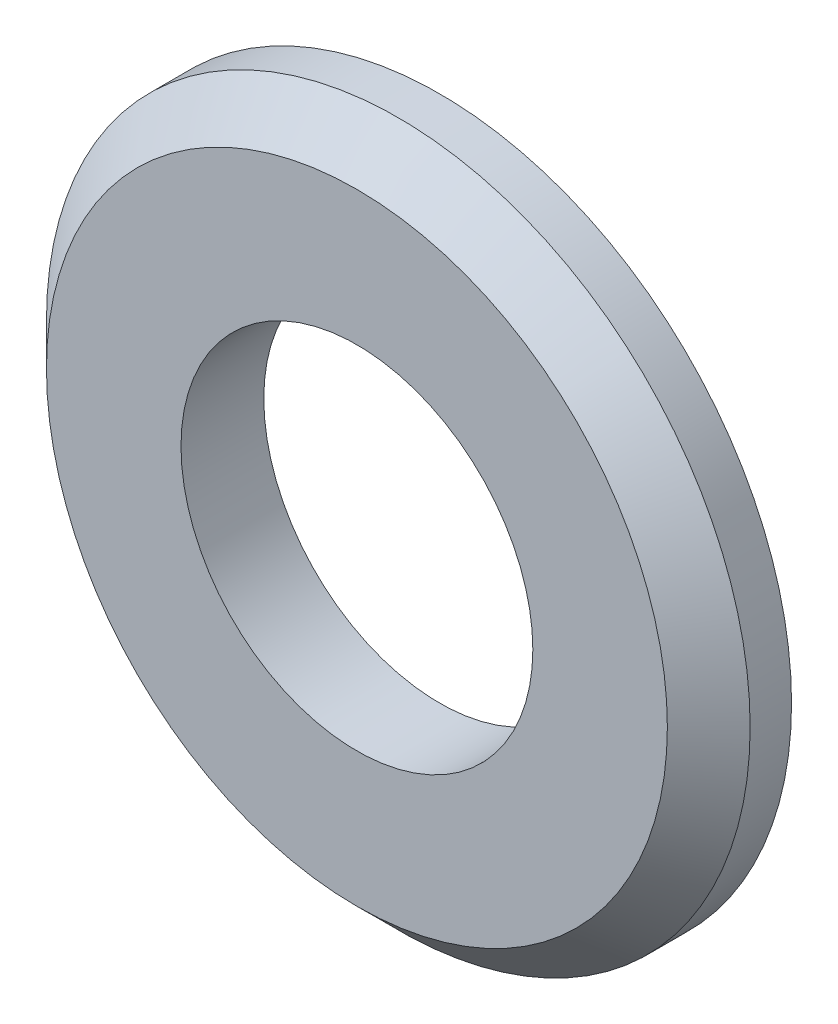
ISO-10303-21;
HEADER;
FILE_DESCRIPTION(('STEP AP214'),'2;1');
FILE_NAME('part.step','',(''),(''),'','','');
FILE_SCHEMA(('AUTOMOTIVE_DESIGN { 1 0 10303 214 1 1 1 1 }'));
ENDSEC;
DATA;
#1=APPLICATION_CONTEXT('core data for automotive mechanical design processes');
#2=APPLICATION_PROTOCOL_DEFINITION('international standard','automotive_design',2000,#1);
#3=PRODUCT_CONTEXT('',#1,'mechanical');
#4=PRODUCT('Part','Part','',(#3));
#5=PRODUCT_RELATED_PRODUCT_CATEGORY('part','',(#4));
#6=PRODUCT_DEFINITION_FORMATION('','',#4);
#7=PRODUCT_DEFINITION_CONTEXT('part definition',#1,'design');
#8=PRODUCT_DEFINITION('design','',#6,#7);
#9=PRODUCT_DEFINITION_SHAPE('','',#8);
#10=(LENGTH_UNIT() NAMED_UNIT(*) SI_UNIT(.MILLI.,.METRE.));
#11=(NAMED_UNIT(*) PLANE_ANGLE_UNIT() SI_UNIT($,.RADIAN.));
#12=(NAMED_UNIT(*) SI_UNIT($,.STERADIAN.) SOLID_ANGLE_UNIT());
#13=UNCERTAINTY_MEASURE_WITH_UNIT(LENGTH_MEASURE(1.E-05),#10,'distance_accuracy_value','');
#14=(GEOMETRIC_REPRESENTATION_CONTEXT(3) GLOBAL_UNCERTAINTY_ASSIGNED_CONTEXT((#13)) GLOBAL_UNIT_ASSIGNED_CONTEXT((#10,
#11,#12)) REPRESENTATION_CONTEXT('',''));
#15=CARTESIAN_POINT('',(0.,0.,0.));
#16=DIRECTION('',(0.,0.,1.));
#17=DIRECTION('',(1.,0.,0.));
#18=AXIS2_PLACEMENT_3D('',#15,#16,#17);
#19=CARTESIAN_POINT('',(0.,0.,2.));
#20=DIRECTION('',(0.,0.,1.));
#21=DIRECTION('',(1.,0.,0.));
#22=AXIS2_PLACEMENT_3D('',#19,#20,#21);
#23=PLANE('',#22);
#24=CARTESIAN_POINT('',(0.,0.,2.));
#25=DIRECTION('',(0.,0.,1.));
#26=DIRECTION('',(1.,0.,0.));
#27=AXIS2_PLACEMENT_3D('',#24,#25,#26);
#28=CIRCLE('',#27,7.49999999999999);
#29=CARTESIAN_POINT('',(7.49999999999999,0.,2.));
#30=VERTEX_POINT('',#29);
#31=EDGE_CURVE('E37',#30,#30,#28,.T.);
#32=ORIENTED_EDGE('',*,*,#31,.T.);
#33=EDGE_LOOP('',(#32));
#34=FACE_BOUND('',#33,.T.);
#35=CARTESIAN_POINT('',(0.,0.,2.));
#36=DIRECTION('',(0.,0.,1.));
#37=DIRECTION('',(1.,0.,0.));
#38=AXIS2_PLACEMENT_3D('',#35,#36,#37);
#39=CIRCLE('',#38,4.25);
#40=CARTESIAN_POINT('',(4.25,0.,2.));
#41=VERTEX_POINT('',#40);
#42=EDGE_CURVE('E45',#41,#41,#39,.T.);
#43=ORIENTED_EDGE('',*,*,#42,.F.);
#44=EDGE_LOOP('',(#43));
#45=FACE_BOUND('',#44,.T.);
#46=ADVANCED_FACE('F30',(#34,#45),#23,.T.);
#47=CARTESIAN_POINT('',(0.,0.,0.));
#48=DIRECTION('',(0.,0.,1.));
#49=DIRECTION('',(1.,0.,0.));
#50=AXIS2_PLACEMENT_3D('',#47,#48,#49);
#51=PLANE('',#50);
#52=CARTESIAN_POINT('',(0.,0.,0.));
#53=DIRECTION('',(0.,0.,1.));
#54=DIRECTION('',(1.,0.,0.));
#55=AXIS2_PLACEMENT_3D('',#52,#53,#54);
#56=CIRCLE('',#55,8.5);
#57=CARTESIAN_POINT('',(8.5,0.,0.));
#58=VERTEX_POINT('',#57);
#59=EDGE_CURVE('E41',#58,#58,#56,.T.);
#60=ORIENTED_EDGE('',*,*,#59,.F.);
#61=EDGE_LOOP('',(#60));
#62=FACE_BOUND('',#61,.T.);
#63=CARTESIAN_POINT('',(0.,0.,0.));
#64=DIRECTION('',(0.,0.,1.));
#65=DIRECTION('',(1.,0.,0.));
#66=AXIS2_PLACEMENT_3D('',#63,#64,#65);
#67=CIRCLE('',#66,4.25);
#68=CARTESIAN_POINT('',(4.25,0.,0.));
#69=VERTEX_POINT('',#68);
#70=EDGE_CURVE('E48',#69,#69,#67,.T.);
#71=ORIENTED_EDGE('',*,*,#70,.T.);
#72=EDGE_LOOP('',(#71));
#73=FACE_BOUND('',#72,.T.);
#74=ADVANCED_FACE('F58',(#62,#73),#51,.F.);
#75=CARTESIAN_POINT('',(0.,0.,2.));
#76=DIRECTION('',(0.,0.,-1.));
#77=DIRECTION('',(-1.,0.,0.));
#78=AXIS2_PLACEMENT_3D('',#75,#76,#77);
#79=CYLINDRICAL_SURFACE('',#78,8.5);
#80=CARTESIAN_POINT('',(0.,0.,0.999999999999985));
#81=DIRECTION('',(0.,0.,1.));
#82=DIRECTION('',(1.,0.,0.));
#83=AXIS2_PLACEMENT_3D('',#80,#81,#82);
#84=CIRCLE('',#83,8.5);
#85=CARTESIAN_POINT('',(8.5,0.,0.999999999999985));
#86=VERTEX_POINT('',#85);
#87=EDGE_CURVE('E10',#86,#86,#84,.F.);
#88=ORIENTED_EDGE('',*,*,#87,.T.);
#89=EDGE_LOOP('',(#88));
#90=FACE_BOUND('',#89,.T.);
#91=ORIENTED_EDGE('',*,*,#59,.T.);
#92=EDGE_LOOP('',(#91));
#93=FACE_BOUND('',#92,.T.);
#94=ADVANCED_FACE('F63',(#90,#93),#79,.T.);
#95=CARTESIAN_POINT('',(0.,0.,2.));
#96=DIRECTION('',(0.,0.,-1.));
#97=DIRECTION('',(-1.,0.,0.));
#98=AXIS2_PLACEMENT_3D('',#95,#96,#97);
#99=CYLINDRICAL_SURFACE('',#98,4.25);
#100=ORIENTED_EDGE('',*,*,#42,.T.);
#101=EDGE_LOOP('',(#100));
#102=FACE_BOUND('',#101,.T.);
#103=ORIENTED_EDGE('',*,*,#70,.F.);
#104=EDGE_LOOP('',(#103));
#105=FACE_BOUND('',#104,.T.);
#106=ADVANCED_FACE('F54',(#102,#105),#99,.F.);
#107=CARTESIAN_POINT('',(0.,0.,2.));
#108=DIRECTION('',(0.,0.,-1.));
#109=DIRECTION('',(-1.,0.,0.));
#110=AXIS2_PLACEMENT_3D('',#107,#108,#109);
#111=CONICAL_SURFACE('',#110,7.49999999999999,0.785398163397447);
#112=ORIENTED_EDGE('',*,*,#87,.F.);
#113=EDGE_LOOP('',(#112));
#114=FACE_BOUND('',#113,.T.);
#115=ORIENTED_EDGE('',*,*,#31,.F.);
#116=EDGE_LOOP('',(#115));
#117=FACE_BOUND('',#116,.T.);
#118=ADVANCED_FACE('F32',(#114,#117),#111,.T.);
#119=CLOSED_SHELL('',(#46,#74,#94,#106,#118));
#120=MANIFOLD_SOLID_BREP('B2',#119);
#121=ADVANCED_BREP_SHAPE_REPRESENTATION('',(#18,#120),#14);
#122=SHAPE_DEFINITION_REPRESENTATION(#9,#121);
ENDSEC;
END-ISO-10303-21;
